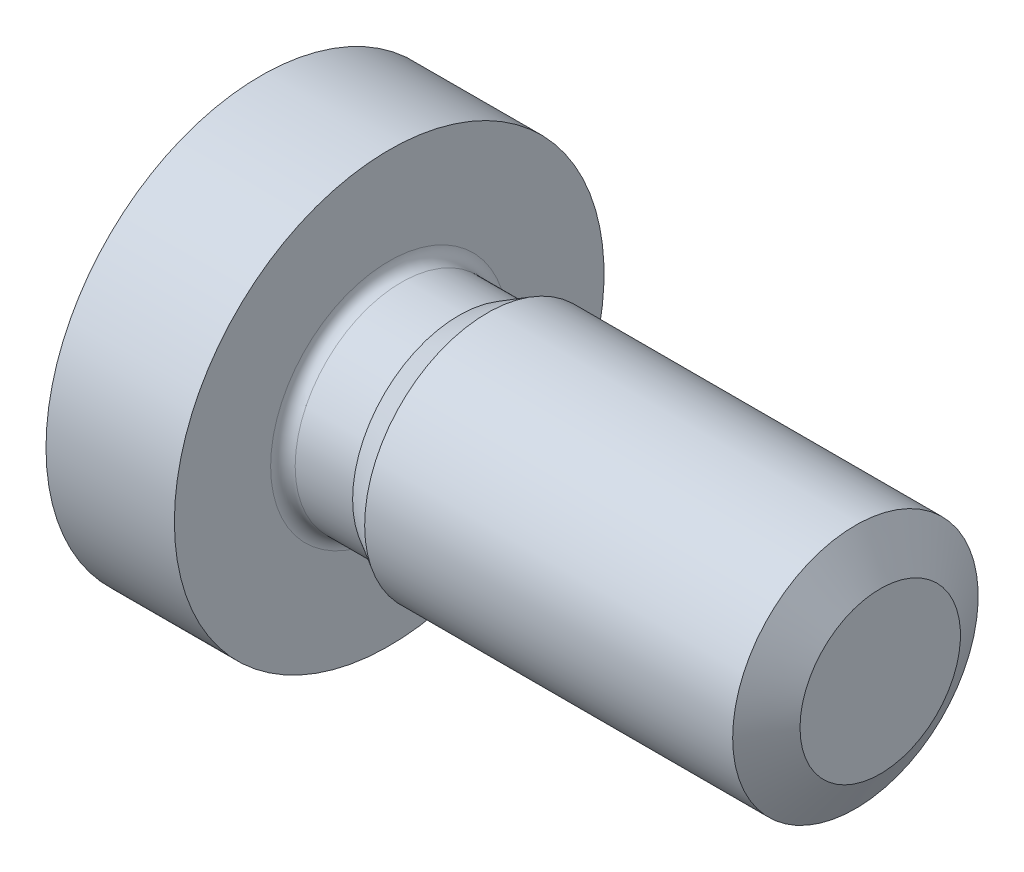
ISO-10303-21;
HEADER;
FILE_DESCRIPTION(('STEP AP214'),'2;1');
FILE_NAME('part.step','',(''),(''),'','','');
FILE_SCHEMA(('AUTOMOTIVE_DESIGN { 1 0 10303 214 1 1 1 1 }'));
ENDSEC;
DATA;
#1=APPLICATION_CONTEXT('core data for automotive mechanical design processes');
#2=APPLICATION_PROTOCOL_DEFINITION('international standard','automotive_design',2000,#1);
#3=PRODUCT_CONTEXT('',#1,'mechanical');
#4=PRODUCT('Part','Part','',(#3));
#5=PRODUCT_RELATED_PRODUCT_CATEGORY('part','',(#4));
#6=PRODUCT_DEFINITION_FORMATION('','',#4);
#7=PRODUCT_DEFINITION_CONTEXT('part definition',#1,'design');
#8=PRODUCT_DEFINITION('design','',#6,#7);
#9=PRODUCT_DEFINITION_SHAPE('','',#8);
#10=(LENGTH_UNIT() NAMED_UNIT(*) SI_UNIT(.MILLI.,.METRE.));
#11=(NAMED_UNIT(*) PLANE_ANGLE_UNIT() SI_UNIT($,.RADIAN.));
#12=(NAMED_UNIT(*) SI_UNIT($,.STERADIAN.) SOLID_ANGLE_UNIT());
#13=UNCERTAINTY_MEASURE_WITH_UNIT(LENGTH_MEASURE(1.E-05),#10,'distance_accuracy_value','');
#14=(GEOMETRIC_REPRESENTATION_CONTEXT(3) GLOBAL_UNCERTAINTY_ASSIGNED_CONTEXT((#13)) GLOBAL_UNIT_ASSIGNED_CONTEXT((#10,
#11,#12)) REPRESENTATION_CONTEXT('',''));
#15=CARTESIAN_POINT('',(0.,0.,0.));
#16=DIRECTION('',(0.,0.,1.));
#17=DIRECTION('',(1.,0.,0.));
#18=AXIS2_PLACEMENT_3D('',#15,#16,#17);
#19=CARTESIAN_POINT('',(-0.437242633952808,0.,0.));
#20=DIRECTION('',(-1.,0.,0.));
#21=DIRECTION('',(0.,0.,1.));
#22=AXIS2_PLACEMENT_3D('',#19,#20,#21);
#23=CYLINDRICAL_SURFACE('',#22,1.);
#24=CARTESIAN_POINT('',(2.2,0.,0.));
#25=DIRECTION('',(-1.,0.,0.));
#26=DIRECTION('',(0.,0.,1.));
#27=AXIS2_PLACEMENT_3D('',#24,#25,#26);
#28=CIRCLE('',#27,1.);
#29=CARTESIAN_POINT('',(2.2,0.,1.));
#30=VERTEX_POINT('',#29);
#31=EDGE_CURVE('E142',#30,#30,#28,.T.);
#32=ORIENTED_EDGE('',*,*,#31,.F.);
#33=EDGE_LOOP('',(#32));
#34=FACE_BOUND('',#33,.T.);
#35=CARTESIAN_POINT('',(5.19783359770231,0.,0.));
#36=DIRECTION('',(-1.,0.,0.));
#37=DIRECTION('',(0.,0.,1.));
#38=AXIS2_PLACEMENT_3D('',#35,#36,#37);
#39=CIRCLE('',#38,1.);
#40=CARTESIAN_POINT('',(5.19783359770231,0.,1.));
#41=VERTEX_POINT('',#40);
#42=EDGE_CURVE('E285',#41,#41,#39,.T.);
#43=ORIENTED_EDGE('',*,*,#42,.T.);
#44=EDGE_LOOP('',(#43));
#45=FACE_BOUND('',#44,.T.);
#46=ADVANCED_FACE('F38',(#34,#45),#23,.T.);
#47=CARTESIAN_POINT('',(4.5,0.,0.));
#48=DIRECTION('',(-1.,0.,0.));
#49=DIRECTION('',(0.,1.,0.));
#50=AXIS2_PLACEMENT_3D('',#47,#48,#49);
#51=SPHERICAL_SURFACE('',#50,4.5);
#52=CARTESIAN_POINT('',(0.35421901205575,0.,0.));
#53=DIRECTION('',(-1.,0.,0.));
#54=DIRECTION('',(0.,0.,1.));
#55=AXIS2_PLACEMENT_3D('',#52,#53,#54);
#56=CIRCLE('',#55,1.75);
#57=CARTESIAN_POINT('',(0.35421901205575,0.,1.75));
#58=VERTEX_POINT('',#57);
#59=EDGE_CURVE('E159',#58,#58,#56,.T.);
#60=ORIENTED_EDGE('',*,*,#59,.T.);
#61=EDGE_LOOP('',(#60));
#62=FACE_BOUND('',#61,.T.);
#63=CARTESIAN_POINT('',(4.36831430997076,-0.665012734647675,0.));
#64=DIRECTION('',(-0.194248010045559,-0.980952450730075,0.));
#65=DIRECTION('',(0.980952450730075,-0.194248010045559,0.));
#66=AXIS2_PLACEMENT_3D('',#63,#64,#65);
#67=CIRCLE('',#66,4.44864214584607);
#68=CARTESIAN_POINT('',(0.111333893585977,0.177953684438417,0.978745264411313));
#69=VERTEX_POINT('',#68);
#70=CARTESIAN_POINT('',(0.00874413846392499,0.198268487432885,0.198268487432886));
#71=VERTEX_POINT('',#70);
#72=EDGE_CURVE('E106',#69,#71,#67,.T.);
#73=ORIENTED_EDGE('',*,*,#72,.F.);
#74=CARTESIAN_POINT('',(2.60640778440429,0.,-1.73866194341061));
#75=DIRECTION('',(-0.736597967736316,0.,-0.676330861285163));
#76=DIRECTION('',(-0.676330861285163,0.,0.736597967736316));
#77=AXIS2_PLACEMENT_3D('',#74,#75,#76);
#78=CIRCLE('',#77,3.69342160706992);
#79=CARTESIAN_POINT('',(0.111333893585977,-0.177953684438424,0.978745264411312));
#80=VERTEX_POINT('',#79);
#81=EDGE_CURVE('E137',#80,#69,#78,.T.);
#82=ORIENTED_EDGE('',*,*,#81,.F.);
#83=CARTESIAN_POINT('',(4.36831430997076,0.665012734647675,0.));
#84=DIRECTION('',(-0.194248010045559,0.980952450730075,0.));
#85=DIRECTION('',(-0.980952450730075,-0.194248010045559,0.));
#86=AXIS2_PLACEMENT_3D('',#83,#84,#85);
#87=CIRCLE('',#86,4.44864214584607);
#88=CARTESIAN_POINT('',(0.00874413846392499,-0.198268487432887,0.198268487432886));
#89=VERTEX_POINT('',#88);
#90=EDGE_CURVE('E132',#89,#80,#87,.T.);
#91=ORIENTED_EDGE('',*,*,#90,.F.);
#92=CARTESIAN_POINT('',(4.36831430997076,0.,-0.665012734647675));
#93=DIRECTION('',(-0.194248010045559,0.,-0.980952450730075));
#94=DIRECTION('',(-0.980952450730075,0.,0.194248010045559));
#95=AXIS2_PLACEMENT_3D('',#92,#93,#94);
#96=CIRCLE('',#95,4.44864214584607);
#97=CARTESIAN_POINT('',(0.111333893585976,-0.978745264411313,0.17795368443842));
#98=VERTEX_POINT('',#97);
#99=EDGE_CURVE('E171',#98,#89,#96,.T.);
#100=ORIENTED_EDGE('',*,*,#99,.F.);
#101=CARTESIAN_POINT('',(2.60640778440429,1.73866194341061,0.));
#102=DIRECTION('',(-0.736597967736316,0.676330861285163,0.));
#103=DIRECTION('',(-0.676330861285163,-0.736597967736316,0.));
#104=AXIS2_PLACEMENT_3D('',#101,#102,#103);
#105=CIRCLE('',#104,3.69342160706992);
#106=CARTESIAN_POINT('',(0.111333893585976,-0.978745264411313,-0.17795368443842));
#107=VERTEX_POINT('',#106);
#108=EDGE_CURVE('E168',#107,#98,#105,.T.);
#109=ORIENTED_EDGE('',*,*,#108,.F.);
#110=CARTESIAN_POINT('',(4.36831430997076,0.,0.665012734647675));
#111=DIRECTION('',(-0.194248010045559,0.,0.980952450730075));
#112=DIRECTION('',(0.980952450730075,0.,0.194248010045559));
#113=AXIS2_PLACEMENT_3D('',#110,#111,#112);
#114=CIRCLE('',#113,4.44864214584607);
#115=CARTESIAN_POINT('',(0.00874413846392499,-0.198268487432886,-0.198268487432886));
#116=VERTEX_POINT('',#115);
#117=EDGE_CURVE('E53',#116,#107,#114,.T.);
#118=ORIENTED_EDGE('',*,*,#117,.F.);
#119=CARTESIAN_POINT('',(0.111333893585976,-0.177953684438417,-0.978745264411314));
#120=VERTEX_POINT('',#119);
#121=EDGE_CURVE('E119',#120,#116,#87,.T.);
#122=ORIENTED_EDGE('',*,*,#121,.F.);
#123=CARTESIAN_POINT('',(2.60640778440429,0.,1.73866194341061));
#124=DIRECTION('',(-0.736597967736316,0.,0.676330861285163));
#125=DIRECTION('',(0.676330861285163,0.,0.736597967736316));
#126=AXIS2_PLACEMENT_3D('',#123,#124,#125);
#127=CIRCLE('',#126,3.69342160706992);
#128=CARTESIAN_POINT('',(0.111333893585976,0.177953684438424,-0.978745264411313));
#129=VERTEX_POINT('',#128);
#130=EDGE_CURVE('E110',#129,#120,#127,.T.);
#131=ORIENTED_EDGE('',*,*,#130,.F.);
#132=CARTESIAN_POINT('',(0.00874413846392499,0.198268487432887,-0.198268487432886));
#133=VERTEX_POINT('',#132);
#134=EDGE_CURVE('E95',#133,#129,#67,.T.);
#135=ORIENTED_EDGE('',*,*,#134,.F.);
#136=CARTESIAN_POINT('',(0.111333893585977,0.978745264411313,-0.17795368443842));
#137=VERTEX_POINT('',#136);
#138=EDGE_CURVE('E46',#137,#133,#114,.T.);
#139=ORIENTED_EDGE('',*,*,#138,.F.);
#140=CARTESIAN_POINT('',(2.60640778440429,-1.73866194341061,0.));
#141=DIRECTION('',(-0.736597967736316,-0.676330861285163,0.));
#142=DIRECTION('',(0.676330861285163,-0.736597967736316,0.));
#143=AXIS2_PLACEMENT_3D('',#140,#141,#142);
#144=CIRCLE('',#143,3.69342160706992);
#145=CARTESIAN_POINT('',(0.111333893585977,0.978745264411313,0.17795368443842));
#146=VERTEX_POINT('',#145);
#147=EDGE_CURVE('E11',#146,#137,#144,.T.);
#148=ORIENTED_EDGE('',*,*,#147,.F.);
#149=EDGE_CURVE('E170',#71,#146,#96,.T.);
#150=ORIENTED_EDGE('',*,*,#149,.F.);
#151=EDGE_LOOP('',(#73,#82,#91,#100,#109,#118,#122,#131,#135,#139,#148,#150));
#152=FACE_BOUND('',#151,.T.);
#153=ADVANCED_FACE('F118',(#62,#152),#51,.T.);
#154=CARTESIAN_POINT('',(1.01,0.,0.));
#155=DIRECTION('',(-0.194248010045559,0.,0.980952450730075));
#156=DIRECTION('',(0.980952450730075,0.,0.194248010045559));
#157=AXIS2_PLACEMENT_3D('',#154,#155,#156);
#158=PLANE('',#157);
#159=ORIENTED_EDGE('',*,*,#138,.T.);
#160=DIRECTION('',(0.962953445521629,-0.190683850598343,0.190683850598342));
#161=VECTOR('',#160,1.);
#162=CARTESIAN_POINT('',(1.01,0.,0.));
#163=LINE('',#162,#161);
#164=CARTESIAN_POINT('',(1.01,0.,0.));
#165=VERTEX_POINT('',#164);
#166=EDGE_CURVE('E101',#133,#165,#163,.T.);
#167=ORIENTED_EDGE('',*,*,#166,.T.);
#168=DIRECTION('',(0.670345779553041,-0.730079561889451,0.132741738525355));
#169=VECTOR('',#168,1.);
#170=CARTESIAN_POINT('',(0.,1.1,-0.2));
#171=LINE('',#170,#169);
#172=EDGE_CURVE('E140',#137,#165,#171,.T.);
#173=ORIENTED_EDGE('',*,*,#172,.F.);
#174=EDGE_LOOP('',(#159,#167,#173));
#175=FACE_BOUND('',#174,.T.);
#176=ADVANCED_FACE('F174',(#175),#158,.T.);
#177=DIRECTION('',(0.670345779553041,0.730079561889451,0.132741738525355));
#178=VECTOR('',#177,1.);
#179=CARTESIAN_POINT('',(0.,-1.1,-0.2));
#180=LINE('',#179,#178);
#181=EDGE_CURVE('E146',#107,#165,#180,.T.);
#182=ORIENTED_EDGE('',*,*,#181,.T.);
#183=DIRECTION('',(-0.96295344552163,-0.190683850598342,-0.190683850598342));
#184=VECTOR('',#183,1.);
#185=CARTESIAN_POINT('',(1.01,0.,0.));
#186=LINE('',#185,#184);
#187=EDGE_CURVE('E124',#165,#116,#186,.T.);
#188=ORIENTED_EDGE('',*,*,#187,.T.);
#189=ORIENTED_EDGE('',*,*,#117,.T.);
#190=EDGE_LOOP('',(#182,#188,#189));
#191=FACE_BOUND('',#190,.T.);
#192=ADVANCED_FACE('F234',(#191),#158,.T.);
#193=CARTESIAN_POINT('',(1.01,0.,0.));
#194=DIRECTION('',(-0.194248010045559,0.,-0.980952450730075));
#195=DIRECTION('',(-0.980952450730075,0.,0.194248010045559));
#196=AXIS2_PLACEMENT_3D('',#193,#194,#195);
#197=PLANE('',#196);
#198=DIRECTION('',(0.670345779553041,-0.730079561889451,-0.132741738525355));
#199=VECTOR('',#198,1.);
#200=CARTESIAN_POINT('',(0.,1.1,0.2));
#201=LINE('',#200,#199);
#202=EDGE_CURVE('E143',#146,#165,#201,.T.);
#203=ORIENTED_EDGE('',*,*,#202,.T.);
#204=DIRECTION('',(-0.96295344552163,0.190683850598342,0.190683850598342));
#205=VECTOR('',#204,1.);
#206=CARTESIAN_POINT('',(1.01,0.,0.));
#207=LINE('',#206,#205);
#208=EDGE_CURVE('E133',#165,#71,#207,.T.);
#209=ORIENTED_EDGE('',*,*,#208,.T.);
#210=ORIENTED_EDGE('',*,*,#149,.T.);
#211=EDGE_LOOP('',(#203,#209,#210));
#212=FACE_BOUND('',#211,.T.);
#213=ADVANCED_FACE('F178',(#212),#197,.T.);
#214=ORIENTED_EDGE('',*,*,#99,.T.);
#215=DIRECTION('',(0.962953445521629,0.190683850598343,-0.190683850598342));
#216=VECTOR('',#215,1.);
#217=CARTESIAN_POINT('',(1.01,0.,0.));
#218=LINE('',#217,#216);
#219=EDGE_CURVE('E120',#89,#165,#218,.T.);
#220=ORIENTED_EDGE('',*,*,#219,.T.);
#221=DIRECTION('',(0.670345779553041,0.730079561889451,-0.132741738525355));
#222=VECTOR('',#221,1.);
#223=CARTESIAN_POINT('',(0.,-1.1,0.2));
#224=LINE('',#223,#222);
#225=EDGE_CURVE('E139',#98,#165,#224,.T.);
#226=ORIENTED_EDGE('',*,*,#225,.F.);
#227=EDGE_LOOP('',(#214,#220,#226));
#228=FACE_BOUND('',#227,.T.);
#229=ADVANCED_FACE('F220',(#228),#197,.T.);
#230=CARTESIAN_POINT('',(-0.437242633952808,0.,0.));
#231=DIRECTION('',(-1.,0.,0.));
#232=DIRECTION('',(0.,0.,1.));
#233=AXIS2_PLACEMENT_3D('',#230,#231,#232);
#234=CYLINDRICAL_SURFACE('',#233,1.75);
#235=ORIENTED_EDGE('',*,*,#59,.F.);
#236=EDGE_LOOP('',(#235));
#237=FACE_BOUND('',#236,.T.);
#238=CARTESIAN_POINT('',(1.4,0.,0.));
#239=DIRECTION('',(-1.,0.,0.));
#240=DIRECTION('',(0.,0.,1.));
#241=AXIS2_PLACEMENT_3D('',#238,#239,#240);
#242=CIRCLE('',#241,1.75);
#243=CARTESIAN_POINT('',(1.4,0.,1.75));
#244=VERTEX_POINT('',#243);
#245=EDGE_CURVE('E155',#244,#244,#242,.T.);
#246=ORIENTED_EDGE('',*,*,#245,.T.);
#247=EDGE_LOOP('',(#246));
#248=FACE_BOUND('',#247,.T.);
#249=ADVANCED_FACE('F217',(#237,#248),#234,.T.);
#250=CARTESIAN_POINT('',(1.4,0.865999999999999,0.));
#251=DIRECTION('',(-1.,0.,0.));
#252=DIRECTION('',(0.,0.,1.));
#253=AXIS2_PLACEMENT_3D('',#250,#251,#252);
#254=PLANE('',#253);
#255=CARTESIAN_POINT('',(1.4,0.,0.));
#256=DIRECTION('',(-1.,0.,0.));
#257=DIRECTION('',(0.,0.,1.));
#258=AXIS2_PLACEMENT_3D('',#255,#256,#257);
#259=CIRCLE('',#258,0.965999999999999);
#260=CARTESIAN_POINT('',(1.4,0.,0.965999999999999));
#261=VERTEX_POINT('',#260);
#262=EDGE_CURVE('E162',#261,#261,#259,.T.);
#263=ORIENTED_EDGE('',*,*,#262,.T.);
#264=EDGE_LOOP('',(#263));
#265=FACE_BOUND('',#264,.T.);
#266=ORIENTED_EDGE('',*,*,#245,.F.);
#267=EDGE_LOOP('',(#266));
#268=FACE_BOUND('',#267,.T.);
#269=ADVANCED_FACE('F213',(#265,#268),#254,.F.);
#270=CARTESIAN_POINT('',(-0.437242633952808,0.,0.));
#271=DIRECTION('',(-1.,0.,0.));
#272=DIRECTION('',(0.,0.,1.));
#273=AXIS2_PLACEMENT_3D('',#270,#271,#272);
#274=CYLINDRICAL_SURFACE('',#273,0.865999999999999);
#275=CARTESIAN_POINT('',(1.5,0.,0.));
#276=DIRECTION('',(-1.,0.,0.));
#277=DIRECTION('',(0.,0.,1.));
#278=AXIS2_PLACEMENT_3D('',#275,#276,#277);
#279=CIRCLE('',#278,0.865999999999999);
#280=CARTESIAN_POINT('',(1.5,0.,0.865999999999999));
#281=VERTEX_POINT('',#280);
#282=EDGE_CURVE('E165',#281,#281,#279,.F.);
#283=ORIENTED_EDGE('',*,*,#282,.T.);
#284=EDGE_LOOP('',(#283));
#285=FACE_BOUND('',#284,.T.);
#286=CARTESIAN_POINT('',(1.96790519178577,0.,0.));
#287=DIRECTION('',(-1.,0.,0.));
#288=DIRECTION('',(0.,0.,1.));
#289=AXIS2_PLACEMENT_3D('',#286,#287,#288);
#290=CIRCLE('',#289,0.866);
#291=CARTESIAN_POINT('',(1.96790519178577,0.,0.866));
#292=VERTEX_POINT('',#291);
#293=EDGE_CURVE('E152',#292,#292,#290,.T.);
#294=ORIENTED_EDGE('',*,*,#293,.T.);
#295=EDGE_LOOP('',(#294));
#296=FACE_BOUND('',#295,.T.);
#297=ADVANCED_FACE('F209',(#285,#296),#274,.T.);
#298=CARTESIAN_POINT('',(2.2,0.,0.));
#299=DIRECTION('',(1.,0.,0.));
#300=DIRECTION('',(0.,0.,-1.));
#301=AXIS2_PLACEMENT_3D('',#298,#299,#300);
#302=CONICAL_SURFACE('',#301,1.,0.523598775598293);
#303=ORIENTED_EDGE('',*,*,#293,.F.);
#304=EDGE_LOOP('',(#303));
#305=FACE_BOUND('',#304,.T.);
#306=ORIENTED_EDGE('',*,*,#31,.T.);
#307=EDGE_LOOP('',(#306));
#308=FACE_BOUND('',#307,.T.);
#309=ADVANCED_FACE('F191',(#305,#308),#302,.T.);
#310=CARTESIAN_POINT('',(1.5,0.,0.));
#311=DIRECTION('',(-1.,0.,0.));
#312=DIRECTION('',(0.,0.,1.));
#313=AXIS2_PLACEMENT_3D('',#310,#311,#312);
#314=TOROIDAL_SURFACE('',#313,0.965999999999999,0.1);
#315=ORIENTED_EDGE('',*,*,#282,.F.);
#316=EDGE_LOOP('',(#315));
#317=FACE_BOUND('',#316,.T.);
#318=ORIENTED_EDGE('',*,*,#262,.F.);
#319=EDGE_LOOP('',(#318));
#320=FACE_BOUND('',#319,.T.);
#321=ADVANCED_FACE('F40',(#317,#320),#314,.F.);
#322=CARTESIAN_POINT('',(0.,1.1,0.2));
#323=DIRECTION('',(-0.736597967736316,-0.676330861285163,0.));
#324=DIRECTION('',(0.676330861285163,-0.736597967736316,0.));
#325=AXIS2_PLACEMENT_3D('',#322,#323,#324);
#326=PLANE('',#325);
#327=ORIENTED_EDGE('',*,*,#147,.T.);
#328=ORIENTED_EDGE('',*,*,#172,.T.);
#329=ORIENTED_EDGE('',*,*,#202,.F.);
#330=EDGE_LOOP('',(#327,#328,#329));
#331=FACE_BOUND('',#330,.T.);
#332=ADVANCED_FACE('F180',(#331),#326,.T.);
#333=CARTESIAN_POINT('',(0.,-1.1,-0.2));
#334=DIRECTION('',(-0.736597967736316,0.676330861285163,0.));
#335=DIRECTION('',(-0.676330861285163,-0.736597967736316,0.));
#336=AXIS2_PLACEMENT_3D('',#333,#334,#335);
#337=PLANE('',#336);
#338=ORIENTED_EDGE('',*,*,#108,.T.);
#339=ORIENTED_EDGE('',*,*,#225,.T.);
#340=ORIENTED_EDGE('',*,*,#181,.F.);
#341=EDGE_LOOP('',(#338,#339,#340));
#342=FACE_BOUND('',#341,.T.);
#343=ADVANCED_FACE('F182',(#342),#337,.T.);
#344=CARTESIAN_POINT('',(1.01,0.,0.));
#345=DIRECTION('',(-0.194248010045559,-0.980952450730075,0.));
#346=DIRECTION('',(0.980952450730075,-0.194248010045559,0.));
#347=AXIS2_PLACEMENT_3D('',#344,#345,#346);
#348=PLANE('',#347);
#349=ORIENTED_EDGE('',*,*,#72,.T.);
#350=ORIENTED_EDGE('',*,*,#208,.F.);
#351=DIRECTION('',(0.670345779553041,-0.132741738525352,-0.730079561889451));
#352=VECTOR('',#351,1.);
#353=CARTESIAN_POINT('',(0.,0.199999999999996,1.1));
#354=LINE('',#353,#352);
#355=EDGE_CURVE('E121',#69,#165,#354,.T.);
#356=ORIENTED_EDGE('',*,*,#355,.F.);
#357=EDGE_LOOP('',(#349,#350,#356));
#358=FACE_BOUND('',#357,.T.);
#359=ADVANCED_FACE('F188',(#358),#348,.T.);
#360=CARTESIAN_POINT('',(1.01,0.,0.));
#361=DIRECTION('',(-0.194248010045559,0.980952450730075,0.));
#362=DIRECTION('',(-0.980952450730075,-0.194248010045559,0.));
#363=AXIS2_PLACEMENT_3D('',#360,#361,#362);
#364=PLANE('',#363);
#365=ORIENTED_EDGE('',*,*,#90,.T.);
#366=DIRECTION('',(0.670345779553041,0.132741738525357,-0.73007956188945));
#367=VECTOR('',#366,1.);
#368=CARTESIAN_POINT('',(0.,-0.200000000000004,1.1));
#369=LINE('',#368,#367);
#370=EDGE_CURVE('E114',#80,#165,#369,.T.);
#371=ORIENTED_EDGE('',*,*,#370,.T.);
#372=ORIENTED_EDGE('',*,*,#219,.F.);
#373=EDGE_LOOP('',(#365,#371,#372));
#374=FACE_BOUND('',#373,.T.);
#375=ADVANCED_FACE('F247',(#374),#364,.T.);
#376=CARTESIAN_POINT('',(0.,-0.200000000000004,1.1));
#377=DIRECTION('',(-0.736597967736316,0.,-0.676330861285163));
#378=DIRECTION('',(0.676330861285163,0.,-0.736597967736316));
#379=AXIS2_PLACEMENT_3D('',#376,#377,#378);
#380=PLANE('',#379);
#381=ORIENTED_EDGE('',*,*,#81,.T.);
#382=ORIENTED_EDGE('',*,*,#355,.T.);
#383=ORIENTED_EDGE('',*,*,#370,.F.);
#384=EDGE_LOOP('',(#381,#382,#383));
#385=FACE_BOUND('',#384,.T.);
#386=ADVANCED_FACE('F252',(#385),#380,.T.);
#387=ORIENTED_EDGE('',*,*,#134,.T.);
#388=DIRECTION('',(0.670345779553041,-0.132741738525357,0.73007956188945));
#389=VECTOR('',#388,1.);
#390=CARTESIAN_POINT('',(0.,0.200000000000004,-1.1));
#391=LINE('',#390,#389);
#392=EDGE_CURVE('E98',#129,#165,#391,.T.);
#393=ORIENTED_EDGE('',*,*,#392,.T.);
#394=ORIENTED_EDGE('',*,*,#166,.F.);
#395=EDGE_LOOP('',(#387,#393,#394));
#396=FACE_BOUND('',#395,.T.);
#397=ADVANCED_FACE('F97',(#396),#348,.T.);
#398=ORIENTED_EDGE('',*,*,#121,.T.);
#399=ORIENTED_EDGE('',*,*,#187,.F.);
#400=DIRECTION('',(0.670345779553041,0.132741738525352,0.730079561889451));
#401=VECTOR('',#400,1.);
#402=CARTESIAN_POINT('',(0.,-0.199999999999996,-1.1));
#403=LINE('',#402,#401);
#404=EDGE_CURVE('E112',#120,#165,#403,.T.);
#405=ORIENTED_EDGE('',*,*,#404,.F.);
#406=EDGE_LOOP('',(#398,#399,#405));
#407=FACE_BOUND('',#406,.T.);
#408=ADVANCED_FACE('F260',(#407),#364,.T.);
#409=CARTESIAN_POINT('',(0.,0.200000000000004,-1.1));
#410=DIRECTION('',(-0.736597967736316,0.,0.676330861285163));
#411=DIRECTION('',(-0.676330861285163,0.,-0.736597967736316));
#412=AXIS2_PLACEMENT_3D('',#409,#410,#411);
#413=PLANE('',#412);
#414=ORIENTED_EDGE('',*,*,#130,.T.);
#415=ORIENTED_EDGE('',*,*,#404,.T.);
#416=ORIENTED_EDGE('',*,*,#392,.F.);
#417=EDGE_LOOP('',(#414,#415,#416));
#418=FACE_BOUND('',#417,.T.);
#419=ADVANCED_FACE('F109',(#418),#413,.T.);
#420=CARTESIAN_POINT('',(5.19783359770231,0.,0.));
#421=DIRECTION('',(-1.,0.,0.));
#422=DIRECTION('',(0.,0.,1.));
#423=AXIS2_PLACEMENT_3D('',#420,#421,#422);
#424=CONICAL_SURFACE('',#423,1.,1.04250708384033);
#425=CARTESIAN_POINT('',(5.4,0.,0.));
#426=DIRECTION('',(-1.,0.,0.));
#427=DIRECTION('',(0.,0.,1.));
#428=AXIS2_PLACEMENT_3D('',#425,#426,#427);
#429=CIRCLE('',#428,0.6536);
#430=CARTESIAN_POINT('',(5.4,0.,0.6536));
#431=VERTEX_POINT('',#430);
#432=EDGE_CURVE('E282',#431,#431,#429,.T.);
#433=ORIENTED_EDGE('',*,*,#432,.T.);
#434=EDGE_LOOP('',(#433));
#435=FACE_BOUND('',#434,.T.);
#436=ORIENTED_EDGE('',*,*,#42,.F.);
#437=EDGE_LOOP('',(#436));
#438=FACE_BOUND('',#437,.T.);
#439=ADVANCED_FACE('F271',(#435,#438),#424,.T.);
#440=CARTESIAN_POINT('',(5.4,0.,0.));
#441=DIRECTION('',(-1.,0.,0.));
#442=DIRECTION('',(0.,0.,1.));
#443=AXIS2_PLACEMENT_3D('',#440,#441,#442);
#444=PLANE('',#443);
#445=ORIENTED_EDGE('',*,*,#432,.F.);
#446=EDGE_LOOP('',(#445));
#447=FACE_BOUND('',#446,.T.);
#448=ADVANCED_FACE('F206',(#447),#444,.F.);
#449=CLOSED_SHELL('',(#46,#153,#176,#192,#213,#229,#249,#269,#297,#309,#321,#332,#343,#359,#375,
#386,#397,#408,#419,#439,#448));
#450=MANIFOLD_SOLID_BREP('B2',#449);
#451=ADVANCED_BREP_SHAPE_REPRESENTATION('',(#18,#450),#14);
#452=SHAPE_DEFINITION_REPRESENTATION(#9,#451);
ENDSEC;
END-ISO-10303-21;
